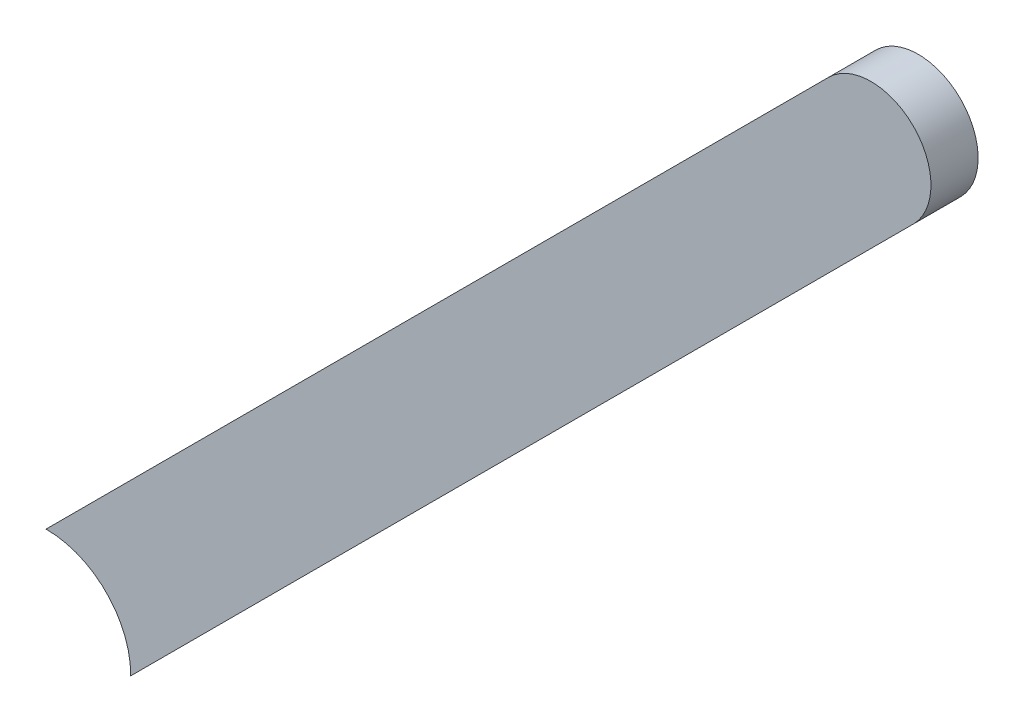
ISO-10303-21;
HEADER;
FILE_DESCRIPTION(('STEP AP214'),'2;1');
FILE_NAME('part.step','',(''),(''),'','','');
FILE_SCHEMA(('AUTOMOTIVE_DESIGN { 1 0 10303 214 1 1 1 1 }'));
ENDSEC;
DATA;
#1=APPLICATION_CONTEXT('core data for automotive mechanical design processes');
#2=APPLICATION_PROTOCOL_DEFINITION('international standard','automotive_design',2000,#1);
#3=PRODUCT_CONTEXT('',#1,'mechanical');
#4=PRODUCT('Part','Part','',(#3));
#5=PRODUCT_RELATED_PRODUCT_CATEGORY('part','',(#4));
#6=PRODUCT_DEFINITION_FORMATION('','',#4);
#7=PRODUCT_DEFINITION_CONTEXT('part definition',#1,'design');
#8=PRODUCT_DEFINITION('design','',#6,#7);
#9=PRODUCT_DEFINITION_SHAPE('','',#8);
#10=(LENGTH_UNIT() NAMED_UNIT(*) SI_UNIT(.MILLI.,.METRE.));
#11=(NAMED_UNIT(*) PLANE_ANGLE_UNIT() SI_UNIT($,.RADIAN.));
#12=(NAMED_UNIT(*) SI_UNIT($,.STERADIAN.) SOLID_ANGLE_UNIT());
#13=UNCERTAINTY_MEASURE_WITH_UNIT(LENGTH_MEASURE(1.E-05),#10,'distance_accuracy_value','');
#14=(GEOMETRIC_REPRESENTATION_CONTEXT(3) GLOBAL_UNCERTAINTY_ASSIGNED_CONTEXT((#13)) GLOBAL_UNIT_ASSIGNED_CONTEXT((#10,
#11,#12)) REPRESENTATION_CONTEXT('',''));
#15=CARTESIAN_POINT('',(0.,0.,0.));
#16=DIRECTION('',(0.,0.,1.));
#17=DIRECTION('',(1.,0.,0.));
#18=AXIS2_PLACEMENT_3D('',#15,#16,#17);
#19=CARTESIAN_POINT('',(124.434581468927,116.455369716854,0.));
#20=DIRECTION('',(-0.707107038205864,0.707106524167138,0.));
#21=DIRECTION('',(0.707106524167138,0.707107038205864,0.));
#22=AXIS2_PLACEMENT_3D('',#19,#20,#21);
#23=PLANE('',#22);
#24=DIRECTION('',(0.707106524167138,0.707107038205864,0.));
#25=VECTOR('',#24,1.);
#26=CARTESIAN_POINT('',(124.25860594,116.27939406,0.1999996));
#27=LINE('',#26,#25);
#28=CARTESIAN_POINT('',(124.434581468927,116.455369716854,0.1999996));
#29=VERTEX_POINT('',#28);
#30=CARTESIAN_POINT('',(127.75260454,119.7733952,0.1999996));
#31=VERTEX_POINT('',#30);
#32=EDGE_CURVE('E11',#29,#31,#27,.T.);
#33=ORIENTED_EDGE('',*,*,#32,.F.);
#34=DIRECTION('',(0.,0.,1.));
#35=VECTOR('',#34,1.);
#36=CARTESIAN_POINT('',(124.434581468927,116.455369716854,0.));
#37=LINE('',#36,#35);
#38=CARTESIAN_POINT('',(124.434581468927,116.455369716854,0.));
#39=VERTEX_POINT('',#38);
#40=EDGE_CURVE('E24',#39,#29,#37,.T.);
#41=ORIENTED_EDGE('',*,*,#40,.F.);
#42=DIRECTION('',(0.707106524167138,0.707107038205864,0.));
#43=VECTOR('',#42,1.);
#44=CARTESIAN_POINT('',(124.25860594,116.27939406,0.));
#45=LINE('',#44,#43);
#46=CARTESIAN_POINT('',(127.75260454,119.7733952,0.));
#47=VERTEX_POINT('',#46);
#48=EDGE_CURVE('E82',#39,#47,#45,.T.);
#49=ORIENTED_EDGE('',*,*,#48,.T.);
#50=DIRECTION('',(0.,0.,1.));
#51=VECTOR('',#50,1.);
#52=CARTESIAN_POINT('',(127.75260454,119.7733952,0.));
#53=LINE('',#52,#51);
#54=EDGE_CURVE('E37',#47,#31,#53,.T.);
#55=ORIENTED_EDGE('',*,*,#54,.T.);
#56=EDGE_LOOP('',(#33,#41,#49,#55));
#57=FACE_BOUND('',#56,.T.);
#58=ADVANCED_FACE('F17',(#57),#23,.F.);
#59=CARTESIAN_POINT('',(127.57299987,119.95299987,0.));
#60=DIRECTION('',(0.,0.,-1.));
#61=DIRECTION('',(0.707106781186576,-0.70710678118652,0.));
#62=AXIS2_PLACEMENT_3D('',#59,#60,#61);
#63=CYLINDRICAL_SURFACE('',#62,0.253999360179536);
#64=CARTESIAN_POINT('',(127.57299987,119.95299987,0.1999996));
#65=DIRECTION('',(0.,0.,1.));
#66=DIRECTION('',(0.707106781186576,-0.70710678118652,0.));
#67=AXIS2_PLACEMENT_3D('',#64,#65,#66);
#68=CIRCLE('',#67,0.253999360179536);
#69=CARTESIAN_POINT('',(127.3933952,120.13260454,0.1999996));
#70=VERTEX_POINT('',#69);
#71=EDGE_CURVE('E97',#31,#70,#68,.T.);
#72=ORIENTED_EDGE('',*,*,#71,.F.);
#73=ORIENTED_EDGE('',*,*,#54,.F.);
#74=CARTESIAN_POINT('',(127.57299987,119.95299987,0.));
#75=DIRECTION('',(0.,0.,1.));
#76=DIRECTION('',(0.707106781186576,-0.70710678118652,0.));
#77=AXIS2_PLACEMENT_3D('',#74,#75,#76);
#78=CIRCLE('',#77,0.253999360179536);
#79=CARTESIAN_POINT('',(127.3933952,120.13260454,0.));
#80=VERTEX_POINT('',#79);
#81=EDGE_CURVE('E94',#47,#80,#78,.T.);
#82=ORIENTED_EDGE('',*,*,#81,.T.);
#83=DIRECTION('',(0.,0.,1.));
#84=VECTOR('',#83,1.);
#85=CARTESIAN_POINT('',(127.3933952,120.13260454,0.));
#86=LINE('',#85,#84);
#87=EDGE_CURVE('E92',#80,#70,#86,.T.);
#88=ORIENTED_EDGE('',*,*,#87,.T.);
#89=EDGE_LOOP('',(#72,#73,#82,#88));
#90=FACE_BOUND('',#89,.T.);
#91=ADVANCED_FACE('F103',(#90),#63,.T.);
#92=CARTESIAN_POINT('',(127.3933952,120.13260454,0.));
#93=DIRECTION('',(0.707106524167139,-0.707107038205863,0.));
#94=DIRECTION('',(-0.707107038205863,-0.707106524167139,0.));
#95=AXIS2_PLACEMENT_3D('',#92,#93,#94);
#96=PLANE('',#95);
#97=DIRECTION('',(-0.707107038205863,-0.707106524167139,0.));
#98=VECTOR('',#97,1.);
#99=CARTESIAN_POINT('',(127.3933952,120.13260454,0.1999996));
#100=LINE('',#99,#98);
#101=CARTESIAN_POINT('',(124.075369716854,116.814581468927,0.1999996));
#102=VERTEX_POINT('',#101);
#103=EDGE_CURVE('E89',#70,#102,#100,.T.);
#104=ORIENTED_EDGE('',*,*,#103,.F.);
#105=ORIENTED_EDGE('',*,*,#87,.F.);
#106=DIRECTION('',(-0.707107038205863,-0.707106524167139,0.));
#107=VECTOR('',#106,1.);
#108=CARTESIAN_POINT('',(127.3933952,120.13260454,0.));
#109=LINE('',#108,#107);
#110=CARTESIAN_POINT('',(124.075369716854,116.814581468927,0.));
#111=VERTEX_POINT('',#110);
#112=EDGE_CURVE('E87',#80,#111,#109,.T.);
#113=ORIENTED_EDGE('',*,*,#112,.T.);
#114=DIRECTION('',(0.,0.,1.));
#115=VECTOR('',#114,1.);
#116=CARTESIAN_POINT('',(124.075369716854,116.814581468927,0.));
#117=LINE('',#116,#115);
#118=EDGE_CURVE('E69',#111,#102,#117,.T.);
#119=ORIENTED_EDGE('',*,*,#118,.T.);
#120=EDGE_LOOP('',(#104,#105,#113,#119));
#121=FACE_BOUND('',#120,.T.);
#122=ADVANCED_FACE('F108',(#121),#96,.F.);
#123=CARTESIAN_POINT('',(124.079,116.459,0.));
#124=DIRECTION('',(0.,0.,-1.));
#125=DIRECTION('',(1.,0.,0.));
#126=AXIS2_PLACEMENT_3D('',#123,#124,#125);
#127=CYLINDRICAL_SURFACE('',#126,0.3556);
#128=DIRECTION('',(0.,0.,1.));
#129=VECTOR('',#128,1.);
#130=CARTESIAN_POINT('',(124.4346,116.459,0.));
#131=LINE('',#130,#129);
#132=CARTESIAN_POINT('',(124.4346,116.459,0.));
#133=VERTEX_POINT('',#132);
#134=CARTESIAN_POINT('',(124.4346,116.459,0.1999996));
#135=VERTEX_POINT('',#134);
#136=EDGE_CURVE('E59',#133,#135,#131,.T.);
#137=ORIENTED_EDGE('',*,*,#136,.T.);
#138=CARTESIAN_POINT('',(124.079,116.459,0.1999996));
#139=DIRECTION('',(0.,0.,1.));
#140=DIRECTION('',(1.,0.,0.));
#141=AXIS2_PLACEMENT_3D('',#138,#139,#140);
#142=CIRCLE('',#141,0.3556);
#143=EDGE_CURVE('E70',#135,#102,#142,.T.);
#144=ORIENTED_EDGE('',*,*,#143,.T.);
#145=ORIENTED_EDGE('',*,*,#118,.F.);
#146=CARTESIAN_POINT('',(124.079,116.459,0.));
#147=DIRECTION('',(0.,0.,1.));
#148=DIRECTION('',(1.,0.,0.));
#149=AXIS2_PLACEMENT_3D('',#146,#147,#148);
#150=CIRCLE('',#149,0.3556);
#151=EDGE_CURVE('E73',#133,#111,#150,.T.);
#152=ORIENTED_EDGE('',*,*,#151,.F.);
#153=EDGE_LOOP('',(#137,#144,#145,#152));
#154=FACE_BOUND('',#153,.T.);
#155=ADVANCED_FACE('F74',(#154),#127,.F.);
#156=CARTESIAN_POINT('',(124.079,116.459,0.));
#157=DIRECTION('',(0.,0.,-1.));
#158=DIRECTION('',(1.,0.,0.));
#159=AXIS2_PLACEMENT_3D('',#156,#157,#158);
#160=CYLINDRICAL_SURFACE('',#159,0.3556);
#161=ORIENTED_EDGE('',*,*,#40,.T.);
#162=CARTESIAN_POINT('',(124.079,116.459,0.1999996));
#163=DIRECTION('',(0.,0.,1.));
#164=DIRECTION('',(1.,0.,0.));
#165=AXIS2_PLACEMENT_3D('',#162,#163,#164);
#166=CIRCLE('',#165,0.3556);
#167=EDGE_CURVE('E65',#29,#135,#166,.T.);
#168=ORIENTED_EDGE('',*,*,#167,.T.);
#169=ORIENTED_EDGE('',*,*,#136,.F.);
#170=EDGE_CURVE('E63',#39,#133,#150,.T.);
#171=ORIENTED_EDGE('',*,*,#170,.F.);
#172=EDGE_LOOP('',(#161,#168,#169,#171));
#173=FACE_BOUND('',#172,.T.);
#174=ADVANCED_FACE('F61',(#173),#160,.F.);
#175=CARTESIAN_POINT('',(124.25860594,116.27939406,0.));
#176=DIRECTION('',(0.,0.,-1.));
#177=DIRECTION('',(-1.,0.,0.));
#178=AXIS2_PLACEMENT_3D('',#175,#176,#177);
#179=PLANE('',#178);
#180=ORIENTED_EDGE('',*,*,#48,.F.);
#181=ORIENTED_EDGE('',*,*,#170,.T.);
#182=ORIENTED_EDGE('',*,*,#151,.T.);
#183=ORIENTED_EDGE('',*,*,#112,.F.);
#184=ORIENTED_EDGE('',*,*,#81,.F.);
#185=EDGE_LOOP('',(#180,#181,#182,#183,#184));
#186=FACE_BOUND('',#185,.T.);
#187=ADVANCED_FACE('F80',(#186),#179,.T.);
#188=CARTESIAN_POINT('',(124.25860594,116.27939406,0.1999996));
#189=DIRECTION('',(0.,0.,-1.));
#190=DIRECTION('',(-1.,0.,0.));
#191=AXIS2_PLACEMENT_3D('',#188,#189,#190);
#192=PLANE('',#191);
#193=ORIENTED_EDGE('',*,*,#167,.F.);
#194=ORIENTED_EDGE('',*,*,#32,.T.);
#195=ORIENTED_EDGE('',*,*,#71,.T.);
#196=ORIENTED_EDGE('',*,*,#103,.T.);
#197=ORIENTED_EDGE('',*,*,#143,.F.);
#198=EDGE_LOOP('',(#193,#194,#195,#196,#197));
#199=FACE_BOUND('',#198,.T.);
#200=ADVANCED_FACE('F106',(#199),#192,.F.);
#201=CLOSED_SHELL('',(#58,#91,#122,#155,#174,#187,#200));
#202=MANIFOLD_SOLID_BREP('B1',#201);
#203=ADVANCED_BREP_SHAPE_REPRESENTATION('',(#18,#202),#14);
#204=SHAPE_DEFINITION_REPRESENTATION(#9,#203);
ENDSEC;
END-ISO-10303-21;
